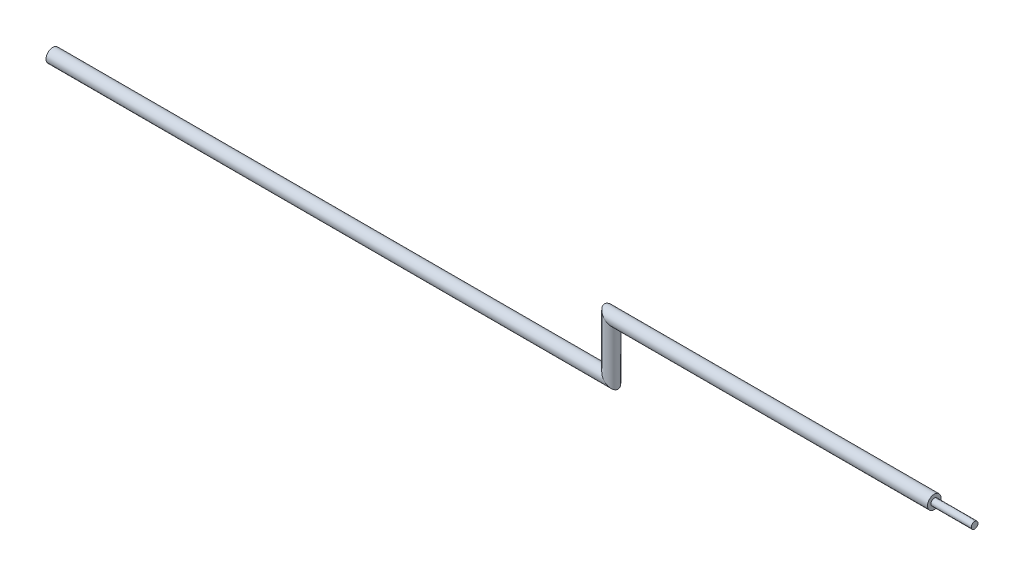
ISO-10303-21;
HEADER;
FILE_DESCRIPTION(('STEP AP214'),'2;1');
FILE_NAME('part.step','',(''),(''),'','','');
FILE_SCHEMA(('AUTOMOTIVE_DESIGN { 1 0 10303 214 1 1 1 1 }'));
ENDSEC;
DATA;
#1=APPLICATION_CONTEXT('core data for automotive mechanical design processes');
#2=APPLICATION_PROTOCOL_DEFINITION('international standard','automotive_design',2000,#1);
#3=PRODUCT_CONTEXT('',#1,'mechanical');
#4=PRODUCT('Part','Part','',(#3));
#5=PRODUCT_RELATED_PRODUCT_CATEGORY('part','',(#4));
#6=PRODUCT_DEFINITION_FORMATION('','',#4);
#7=PRODUCT_DEFINITION_CONTEXT('part definition',#1,'design');
#8=PRODUCT_DEFINITION('design','',#6,#7);
#9=PRODUCT_DEFINITION_SHAPE('','',#8);
#10=(LENGTH_UNIT() NAMED_UNIT(*) SI_UNIT(.MILLI.,.METRE.));
#11=(NAMED_UNIT(*) PLANE_ANGLE_UNIT() SI_UNIT($,.RADIAN.));
#12=(NAMED_UNIT(*) SI_UNIT($,.STERADIAN.) SOLID_ANGLE_UNIT());
#13=UNCERTAINTY_MEASURE_WITH_UNIT(LENGTH_MEASURE(1.E-05),#10,'distance_accuracy_value','');
#14=(GEOMETRIC_REPRESENTATION_CONTEXT(3) GLOBAL_UNCERTAINTY_ASSIGNED_CONTEXT((#13)) GLOBAL_UNIT_ASSIGNED_CONTEXT((#10,
#11,#12)) REPRESENTATION_CONTEXT('',''));
#15=CARTESIAN_POINT('',(0.,0.,0.));
#16=DIRECTION('',(0.,0.,1.));
#17=DIRECTION('',(1.,0.,0.));
#18=AXIS2_PLACEMENT_3D('',#15,#16,#17);
#19=CARTESIAN_POINT('',(0.,1.52655665885959E-13,0.));
#20=DIRECTION('',(-1.,0.,0.));
#21=DIRECTION('',(0.,0.,1.));
#22=AXIS2_PLACEMENT_3D('',#19,#20,#21);
#23=PLANE('',#22);
#24=CARTESIAN_POINT('',(0.,1.52655665885959E-13,0.));
#25=DIRECTION('',(-1.,0.,0.));
#26=DIRECTION('',(0.,0.,1.));
#27=AXIS2_PLACEMENT_3D('',#24,#25,#26);
#28=CIRCLE('',#27,6.35);
#29=CARTESIAN_POINT('',(0.,1.52655665885959E-13,6.35));
#30=VERTEX_POINT('',#29);
#31=EDGE_CURVE('E42',#30,#30,#28,.T.);
#32=ORIENTED_EDGE('',*,*,#31,.T.);
#33=EDGE_LOOP('',(#32));
#34=FACE_BOUND('',#33,.T.);
#35=ADVANCED_FACE('F39',(#34),#23,.T.);
#36=CARTESIAN_POINT('',(831.85,50.8,0.));
#37=DIRECTION('',(-1.,0.,0.));
#38=DIRECTION('',(0.,0.,1.));
#39=AXIS2_PLACEMENT_3D('',#36,#37,#38);
#40=PLANE('',#39);
#41=CARTESIAN_POINT('',(831.85,50.8000000000002,0.));
#42=DIRECTION('',(1.,0.,0.));
#43=DIRECTION('',(0.,1.,0.));
#44=AXIS2_PLACEMENT_3D('',#41,#42,#43);
#45=CIRCLE('',#44,3.175);
#46=CARTESIAN_POINT('',(831.85,47.6250000000002,0.));
#47=VERTEX_POINT('',#46);
#48=EDGE_CURVE('E12',#47,#47,#45,.T.);
#49=ORIENTED_EDGE('',*,*,#48,.F.);
#50=EDGE_LOOP('',(#49));
#51=FACE_BOUND('',#50,.T.);
#52=CARTESIAN_POINT('',(831.85,50.8,0.));
#53=DIRECTION('',(-1.,0.,0.));
#54=DIRECTION('',(0.,0.,1.));
#55=AXIS2_PLACEMENT_3D('',#52,#53,#54);
#56=CIRCLE('',#55,6.35);
#57=CARTESIAN_POINT('',(831.85,50.8,6.35));
#58=VERTEX_POINT('',#57);
#59=EDGE_CURVE('E68',#58,#58,#56,.T.);
#60=ORIENTED_EDGE('',*,*,#59,.F.);
#61=EDGE_LOOP('',(#60));
#62=FACE_BOUND('',#61,.T.);
#63=ADVANCED_FACE('F86',(#51,#62),#40,.F.);
#64=CARTESIAN_POINT('',(541.12,1.52655665885959E-13,0.));
#65=DIRECTION('',(-1.,0.,0.));
#66=DIRECTION('',(0.,-1.,0.));
#67=AXIS2_PLACEMENT_3D('',#64,#65,#66);
#68=CYLINDRICAL_SURFACE('',#67,6.35);
#69=CARTESIAN_POINT('',(527.05,1.11022302462516E-13,0.));
#70=DIRECTION('',(-0.707106781186547,-0.707106781186547,0.));
#71=DIRECTION('',(0.707106781186548,-0.707106781186548,0.));
#72=AXIS2_PLACEMENT_3D('',#69,#70,#71);
#73=ELLIPSE('',#72,8.98025612106915,6.35);
#74=CARTESIAN_POINT('',(533.4,-6.34999999999989,0.));
#75=VERTEX_POINT('',#74);
#76=EDGE_CURVE('E57',#75,#75,#73,.F.);
#77=ORIENTED_EDGE('',*,*,#76,.F.);
#78=EDGE_LOOP('',(#77));
#79=FACE_BOUND('',#78,.T.);
#80=ORIENTED_EDGE('',*,*,#31,.F.);
#81=EDGE_LOOP('',(#80));
#82=FACE_BOUND('',#81,.T.);
#83=ADVANCED_FACE('F89',(#79,#82),#68,.T.);
#84=CARTESIAN_POINT('',(527.05,64.8700000000002,0.));
#85=DIRECTION('',(0.,-1.,0.));
#86=DIRECTION('',(0.,0.,-1.));
#87=AXIS2_PLACEMENT_3D('',#84,#85,#86);
#88=CYLINDRICAL_SURFACE('',#87,6.35);
#89=CARTESIAN_POINT('',(527.05,50.8,0.));
#90=DIRECTION('',(-0.707106781186548,-0.707106781186548,0.));
#91=DIRECTION('',(-0.707106781186548,0.707106781186548,0.));
#92=AXIS2_PLACEMENT_3D('',#89,#90,#91);
#93=ELLIPSE('',#92,8.98025612106915,6.35);
#94=CARTESIAN_POINT('',(520.7,57.15,0.));
#95=VERTEX_POINT('',#94);
#96=EDGE_CURVE('E47',#95,#95,#93,.F.);
#97=ORIENTED_EDGE('',*,*,#96,.F.);
#98=EDGE_LOOP('',(#97));
#99=FACE_BOUND('',#98,.T.);
#100=ORIENTED_EDGE('',*,*,#76,.T.);
#101=EDGE_LOOP('',(#100));
#102=FACE_BOUND('',#101,.T.);
#103=ADVANCED_FACE('F65',(#99,#102),#88,.T.);
#104=CARTESIAN_POINT('',(831.85,50.8,0.));
#105=DIRECTION('',(-1.,0.,0.));
#106=DIRECTION('',(0.,0.,1.));
#107=AXIS2_PLACEMENT_3D('',#104,#105,#106);
#108=CYLINDRICAL_SURFACE('',#107,6.35);
#109=ORIENTED_EDGE('',*,*,#59,.T.);
#110=EDGE_LOOP('',(#109));
#111=FACE_BOUND('',#110,.T.);
#112=ORIENTED_EDGE('',*,*,#96,.T.);
#113=EDGE_LOOP('',(#112));
#114=FACE_BOUND('',#113,.T.);
#115=ADVANCED_FACE('F82',(#111,#114),#108,.T.);
#116=CARTESIAN_POINT('',(869.95,50.8000000000002,0.));
#117=DIRECTION('',(-1.,0.,0.));
#118=DIRECTION('',(0.,-1.,0.));
#119=AXIS2_PLACEMENT_3D('',#116,#117,#118);
#120=CYLINDRICAL_SURFACE('',#119,3.175);
#121=CARTESIAN_POINT('',(869.95,50.8000000000002,0.));
#122=DIRECTION('',(1.,0.,0.));
#123=DIRECTION('',(0.,1.,0.));
#124=AXIS2_PLACEMENT_3D('',#121,#122,#123);
#125=CIRCLE('',#124,3.175);
#126=CARTESIAN_POINT('',(869.95,47.6250000000002,0.));
#127=VERTEX_POINT('',#126);
#128=EDGE_CURVE('E72',#127,#127,#125,.T.);
#129=CARTESIAN_POINT('',(869.95,47.6250000000002,0.));
#130=CARTESIAN_POINT('',(869.553125,47.6250000000002,0.));
#131=CARTESIAN_POINT('',(869.15625,47.6250000000002,0.));
#132=CARTESIAN_POINT('',(868.3625,47.6250000000002,0.));
#133=CARTESIAN_POINT('',(867.965625,47.6250000000002,0.));
#134=CARTESIAN_POINT('',(867.171875,47.6250000000002,0.));
#135=CARTESIAN_POINT('',(866.775,47.6250000000002,0.));
#136=CARTESIAN_POINT('',(865.98125,47.6250000000002,0.));
#137=CARTESIAN_POINT('',(865.584375,47.6250000000002,0.));
#138=CARTESIAN_POINT('',(864.790625,47.6250000000002,0.));
#139=CARTESIAN_POINT('',(864.39375,47.6250000000002,0.));
#140=CARTESIAN_POINT('',(863.6,47.6250000000002,0.));
#141=CARTESIAN_POINT('',(863.203125,47.6250000000002,0.));
#142=CARTESIAN_POINT('',(862.409375,47.6250000000002,0.));
#143=CARTESIAN_POINT('',(862.0125,47.6250000000002,0.));
#144=CARTESIAN_POINT('',(861.21875,47.6250000000002,0.));
#145=CARTESIAN_POINT('',(860.821875,47.6250000000002,0.));
#146=CARTESIAN_POINT('',(860.028125,47.6250000000002,0.));
#147=CARTESIAN_POINT('',(859.63125,47.6250000000002,0.));
#148=CARTESIAN_POINT('',(858.8375,47.6250000000002,0.));
#149=CARTESIAN_POINT('',(858.440625,47.6250000000002,0.));
#150=CARTESIAN_POINT('',(857.646875,47.6250000000002,0.));
#151=CARTESIAN_POINT('',(857.25,47.6250000000002,0.));
#152=CARTESIAN_POINT('',(856.45625,47.6250000000002,0.));
#153=CARTESIAN_POINT('',(856.059375,47.6250000000002,0.));
#154=CARTESIAN_POINT('',(855.265625,47.6250000000002,0.));
#155=CARTESIAN_POINT('',(854.86875,47.6250000000002,0.));
#156=CARTESIAN_POINT('',(854.075,47.6250000000002,0.));
#157=CARTESIAN_POINT('',(853.678125,47.6250000000002,0.));
#158=CARTESIAN_POINT('',(852.884375,47.6250000000002,0.));
#159=CARTESIAN_POINT('',(852.4875,47.6250000000002,0.));
#160=CARTESIAN_POINT('',(851.69375,47.6250000000002,0.));
#161=CARTESIAN_POINT('',(851.296875,47.6250000000002,0.));
#162=CARTESIAN_POINT('',(850.503125,47.6250000000002,0.));
#163=CARTESIAN_POINT('',(850.10625,47.6250000000002,0.));
#164=CARTESIAN_POINT('',(849.3125,47.6250000000002,0.));
#165=CARTESIAN_POINT('',(848.915625,47.6250000000002,0.));
#166=CARTESIAN_POINT('',(848.121875,47.6250000000002,0.));
#167=CARTESIAN_POINT('',(847.725,47.6250000000002,0.));
#168=CARTESIAN_POINT('',(846.93125,47.6250000000002,0.));
#169=CARTESIAN_POINT('',(846.534375,47.6250000000002,0.));
#170=CARTESIAN_POINT('',(845.740625,47.6250000000002,0.));
#171=CARTESIAN_POINT('',(845.34375,47.6250000000002,0.));
#172=CARTESIAN_POINT('',(844.55,47.6250000000002,0.));
#173=CARTESIAN_POINT('',(844.153125,47.6250000000002,0.));
#174=CARTESIAN_POINT('',(843.359375,47.6250000000002,0.));
#175=CARTESIAN_POINT('',(842.9625,47.6250000000002,0.));
#176=CARTESIAN_POINT('',(842.16875,47.6250000000002,0.));
#177=CARTESIAN_POINT('',(841.771875,47.6250000000002,0.));
#178=CARTESIAN_POINT('',(840.978125,47.6250000000002,0.));
#179=CARTESIAN_POINT('',(840.58125,47.6250000000002,0.));
#180=CARTESIAN_POINT('',(839.7875,47.6250000000002,0.));
#181=CARTESIAN_POINT('',(839.390625,47.6250000000002,0.));
#182=CARTESIAN_POINT('',(838.596875,47.6250000000002,0.));
#183=CARTESIAN_POINT('',(838.2,47.6250000000002,0.));
#184=CARTESIAN_POINT('',(837.40625,47.6250000000002,0.));
#185=CARTESIAN_POINT('',(837.009375,47.6250000000002,0.));
#186=CARTESIAN_POINT('',(836.215625,47.6250000000002,0.));
#187=CARTESIAN_POINT('',(835.81875,47.6250000000002,0.));
#188=CARTESIAN_POINT('',(835.025,47.6250000000002,0.));
#189=CARTESIAN_POINT('',(834.628125,47.6250000000002,0.));
#190=CARTESIAN_POINT('',(833.834375,47.6250000000002,0.));
#191=CARTESIAN_POINT('',(833.4375,47.6250000000002,0.));
#192=CARTESIAN_POINT('',(832.64375,47.6250000000002,0.));
#193=CARTESIAN_POINT('',(832.246875,47.6250000000002,0.));
#194=CARTESIAN_POINT('',(831.85,47.6250000000002,0.));
#195=B_SPLINE_CURVE_WITH_KNOTS('',3,(#129,#130,#131,#132,#133,#134,#135,#136,#137,#138,#139,
#140,#141,#142,#143,#144,#145,#146,#147,#148,#149,#150,#151,#152,#153,#154,#155,#156,#157,#158,
#159,#160,#161,#162,#163,#164,#165,#166,#167,#168,#169,#170,#171,#172,#173,#174,#175,#176,#177,
#178,#179,#180,#181,#182,#183,#184,#185,#186,#187,#188,#189,#190,#191,#192,#193,#194),
.UNSPECIFIED.,.F.,.F.,(4,2,2,2,2,2,2,2,2,2,2,2,2,2,2,2,2,2,2,2,2,2,2,2,2,2,2,2,2,2,2,2,4),(0.,
1.19062500000011,2.38125000000011,3.57187500000011,4.76250000000011,5.95312500000011,
7.14375000000012,8.33437500000012,9.52500000000012,10.7156250000001,11.9062500000001,
13.0968750000001,14.2875000000001,15.4781250000001,16.6687500000001,17.8593750000001,
19.0500000000001,20.2406250000001,21.4312500000001,22.6218750000001,23.8125000000001,
25.0031250000001,26.1937500000001,27.3843750000001,28.5750000000001,29.7656250000001,
30.9562500000001,32.1468750000001,33.3375000000001,34.5281250000001,35.7187500000001,
36.9093750000001,38.1000000000001),.UNSPECIFIED.);
#196=EDGE_CURVE('BSEAM79',#127,#47,#195,.T.);
#197=ORIENTED_EDGE('',*,*,#128,.F.);
#198=ORIENTED_EDGE('',*,*,#48,.T.);
#199=ORIENTED_EDGE('',*,*,#196,.T.);
#200=ORIENTED_EDGE('',*,*,#196,.F.);
#201=EDGE_LOOP('',(#197,#199,#198,#200));
#202=FACE_BOUND('',#201,.T.);
#203=ADVANCED_FACE('F79',(#202),#120,.T.);
#204=CARTESIAN_POINT('',(869.95,50.8000000000002,0.));
#205=DIRECTION('',(1.,0.,0.));
#206=DIRECTION('',(0.,1.,0.));
#207=AXIS2_PLACEMENT_3D('',#204,#205,#206);
#208=PLANE('',#207);
#209=ORIENTED_EDGE('',*,*,#128,.T.);
#210=EDGE_LOOP('',(#209));
#211=FACE_BOUND('',#210,.T.);
#212=ADVANCED_FACE('F77',(#211),#208,.T.);
#213=CLOSED_SHELL('',(#35,#63,#83,#103,#115,#203,#212));
#214=MANIFOLD_SOLID_BREP('B2',#213);
#215=ADVANCED_BREP_SHAPE_REPRESENTATION('',(#18,#214),#14);
#216=SHAPE_DEFINITION_REPRESENTATION(#9,#215);
ENDSEC;
END-ISO-10303-21;
